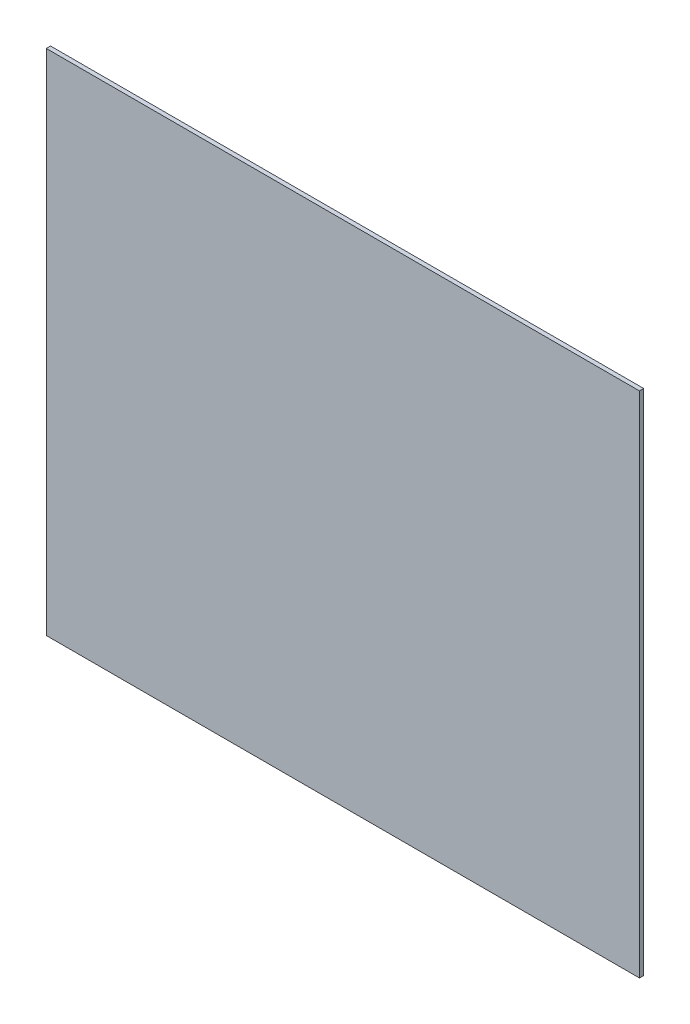
ISO-10303-21;
HEADER;
FILE_DESCRIPTION(('STEP AP214'),'2;1');
FILE_NAME('part.step','',(''),(''),'','','');
FILE_SCHEMA(('AUTOMOTIVE_DESIGN { 1 0 10303 214 1 1 1 1 }'));
ENDSEC;
DATA;
#1=APPLICATION_CONTEXT('core data for automotive mechanical design processes');
#2=APPLICATION_PROTOCOL_DEFINITION('international standard','automotive_design',2000,#1);
#3=PRODUCT_CONTEXT('',#1,'mechanical');
#4=PRODUCT('Part','Part','',(#3));
#5=PRODUCT_RELATED_PRODUCT_CATEGORY('part','',(#4));
#6=PRODUCT_DEFINITION_FORMATION('','',#4);
#7=PRODUCT_DEFINITION_CONTEXT('part definition',#1,'design');
#8=PRODUCT_DEFINITION('design','',#6,#7);
#9=PRODUCT_DEFINITION_SHAPE('','',#8);
#10=(LENGTH_UNIT() NAMED_UNIT(*) SI_UNIT(.MILLI.,.METRE.));
#11=(NAMED_UNIT(*) PLANE_ANGLE_UNIT() SI_UNIT($,.RADIAN.));
#12=(NAMED_UNIT(*) SI_UNIT($,.STERADIAN.) SOLID_ANGLE_UNIT());
#13=UNCERTAINTY_MEASURE_WITH_UNIT(LENGTH_MEASURE(1.E-05),#10,'distance_accuracy_value','');
#14=(GEOMETRIC_REPRESENTATION_CONTEXT(3) GLOBAL_UNCERTAINTY_ASSIGNED_CONTEXT((#13)) GLOBAL_UNIT_ASSIGNED_CONTEXT((#10,
#11,#12)) REPRESENTATION_CONTEXT('',''));
#15=CARTESIAN_POINT('',(0.,0.,0.));
#16=DIRECTION('',(0.,0.,1.));
#17=DIRECTION('',(1.,0.,0.));
#18=AXIS2_PLACEMENT_3D('',#15,#16,#17);
#19=CARTESIAN_POINT('',(-140.,-120.,2.));
#20=DIRECTION('',(1.,0.,0.));
#21=DIRECTION('',(0.,0.,-1.));
#22=AXIS2_PLACEMENT_3D('',#19,#20,#21);
#23=PLANE('',#22);
#24=DIRECTION('',(0.,-1.,0.));
#25=VECTOR('',#24,1.);
#26=CARTESIAN_POINT('',(-140.,-120.,0.));
#27=LINE('',#26,#25);
#28=CARTESIAN_POINT('',(-140.,120.,0.));
#29=VERTEX_POINT('',#28);
#30=CARTESIAN_POINT('',(-140.,-120.,0.));
#31=VERTEX_POINT('',#30);
#32=EDGE_CURVE('E98',#29,#31,#27,.T.);
#33=ORIENTED_EDGE('',*,*,#32,.T.);
#34=DIRECTION('',(0.,0.,-1.));
#35=VECTOR('',#34,1.);
#36=CARTESIAN_POINT('',(-140.,-120.,2.));
#37=LINE('',#36,#35);
#38=CARTESIAN_POINT('',(-140.,-120.,2.));
#39=VERTEX_POINT('',#38);
#40=EDGE_CURVE('E11',#39,#31,#37,.T.);
#41=ORIENTED_EDGE('',*,*,#40,.F.);
#42=DIRECTION('',(0.,-1.,0.));
#43=VECTOR('',#42,1.);
#44=CARTESIAN_POINT('',(-140.,-120.,2.));
#45=LINE('',#44,#43);
#46=CARTESIAN_POINT('',(-140.,120.,2.));
#47=VERTEX_POINT('',#46);
#48=EDGE_CURVE('E86',#47,#39,#45,.T.);
#49=ORIENTED_EDGE('',*,*,#48,.F.);
#50=DIRECTION('',(0.,0.,-1.));
#51=VECTOR('',#50,1.);
#52=CARTESIAN_POINT('',(-140.,120.,2.));
#53=LINE('',#52,#51);
#54=EDGE_CURVE('E94',#47,#29,#53,.T.);
#55=ORIENTED_EDGE('',*,*,#54,.T.);
#56=EDGE_LOOP('',(#33,#41,#49,#55));
#57=FACE_BOUND('',#56,.T.);
#58=ADVANCED_FACE('F35',(#57),#23,.F.);
#59=CARTESIAN_POINT('',(140.,-120.,2.));
#60=DIRECTION('',(0.,1.,0.));
#61=DIRECTION('',(-1.,0.,0.));
#62=AXIS2_PLACEMENT_3D('',#59,#60,#61);
#63=PLANE('',#62);
#64=DIRECTION('',(1.,0.,0.));
#65=VECTOR('',#64,1.);
#66=CARTESIAN_POINT('',(140.,-120.,0.));
#67=LINE('',#66,#65);
#68=CARTESIAN_POINT('',(140.,-120.,0.));
#69=VERTEX_POINT('',#68);
#70=EDGE_CURVE('E90',#31,#69,#67,.T.);
#71=ORIENTED_EDGE('',*,*,#70,.T.);
#72=DIRECTION('',(0.,0.,-1.));
#73=VECTOR('',#72,1.);
#74=CARTESIAN_POINT('',(140.,-120.,2.));
#75=LINE('',#74,#73);
#76=CARTESIAN_POINT('',(140.,-120.,2.));
#77=VERTEX_POINT('',#76);
#78=EDGE_CURVE('E43',#77,#69,#75,.T.);
#79=ORIENTED_EDGE('',*,*,#78,.F.);
#80=DIRECTION('',(1.,0.,0.));
#81=VECTOR('',#80,1.);
#82=CARTESIAN_POINT('',(140.,-120.,2.));
#83=LINE('',#82,#81);
#84=EDGE_CURVE('E81',#39,#77,#83,.T.);
#85=ORIENTED_EDGE('',*,*,#84,.F.);
#86=ORIENTED_EDGE('',*,*,#40,.T.);
#87=EDGE_LOOP('',(#71,#79,#85,#86));
#88=FACE_BOUND('',#87,.T.);
#89=ADVANCED_FACE('F89',(#88),#63,.F.);
#90=CARTESIAN_POINT('',(140.,-120.,2.));
#91=DIRECTION('',(-1.,0.,0.));
#92=DIRECTION('',(0.,0.,1.));
#93=AXIS2_PLACEMENT_3D('',#90,#91,#92);
#94=PLANE('',#93);
#95=DIRECTION('',(0.,1.,0.));
#96=VECTOR('',#95,1.);
#97=CARTESIAN_POINT('',(140.,-120.,0.));
#98=LINE('',#97,#96);
#99=CARTESIAN_POINT('',(140.,120.,0.));
#100=VERTEX_POINT('',#99);
#101=EDGE_CURVE('E68',#69,#100,#98,.T.);
#102=ORIENTED_EDGE('',*,*,#101,.T.);
#103=DIRECTION('',(0.,0.,-1.));
#104=VECTOR('',#103,1.);
#105=CARTESIAN_POINT('',(140.,120.,2.));
#106=LINE('',#105,#104);
#107=CARTESIAN_POINT('',(140.,120.,2.));
#108=VERTEX_POINT('',#107);
#109=EDGE_CURVE('E91',#108,#100,#106,.T.);
#110=ORIENTED_EDGE('',*,*,#109,.F.);
#111=DIRECTION('',(0.,1.,0.));
#112=VECTOR('',#111,1.);
#113=CARTESIAN_POINT('',(140.,-120.,2.));
#114=LINE('',#113,#112);
#115=EDGE_CURVE('E84',#77,#108,#114,.T.);
#116=ORIENTED_EDGE('',*,*,#115,.F.);
#117=ORIENTED_EDGE('',*,*,#78,.T.);
#118=EDGE_LOOP('',(#102,#110,#116,#117));
#119=FACE_BOUND('',#118,.T.);
#120=ADVANCED_FACE('F92',(#119),#94,.F.);
#121=CARTESIAN_POINT('',(140.,120.,2.));
#122=DIRECTION('',(0.,-1.,0.));
#123=DIRECTION('',(1.,0.,0.));
#124=AXIS2_PLACEMENT_3D('',#121,#122,#123);
#125=PLANE('',#124);
#126=DIRECTION('',(-1.,0.,0.));
#127=VECTOR('',#126,1.);
#128=CARTESIAN_POINT('',(140.,120.,0.));
#129=LINE('',#128,#127);
#130=EDGE_CURVE('E74',#100,#29,#129,.T.);
#131=ORIENTED_EDGE('',*,*,#130,.T.);
#132=ORIENTED_EDGE('',*,*,#54,.F.);
#133=DIRECTION('',(-1.,0.,0.));
#134=VECTOR('',#133,1.);
#135=CARTESIAN_POINT('',(140.,120.,2.));
#136=LINE('',#135,#134);
#137=EDGE_CURVE('E51',#108,#47,#136,.T.);
#138=ORIENTED_EDGE('',*,*,#137,.F.);
#139=ORIENTED_EDGE('',*,*,#109,.T.);
#140=EDGE_LOOP('',(#131,#132,#138,#139));
#141=FACE_BOUND('',#140,.T.);
#142=ADVANCED_FACE('F105',(#141),#125,.F.);
#143=CARTESIAN_POINT('',(0.,0.,2.));
#144=DIRECTION('',(0.,0.,1.));
#145=DIRECTION('',(1.,0.,0.));
#146=AXIS2_PLACEMENT_3D('',#143,#144,#145);
#147=PLANE('',#146);
#148=ORIENTED_EDGE('',*,*,#48,.T.);
#149=ORIENTED_EDGE('',*,*,#84,.T.);
#150=ORIENTED_EDGE('',*,*,#115,.T.);
#151=ORIENTED_EDGE('',*,*,#137,.T.);
#152=EDGE_LOOP('',(#148,#149,#150,#151));
#153=FACE_BOUND('',#152,.T.);
#154=ADVANCED_FACE('F82',(#153),#147,.T.);
#155=CARTESIAN_POINT('',(0.,0.,0.));
#156=DIRECTION('',(0.,0.,1.));
#157=DIRECTION('',(1.,0.,0.));
#158=AXIS2_PLACEMENT_3D('',#155,#156,#157);
#159=PLANE('',#158);
#160=ORIENTED_EDGE('',*,*,#32,.F.);
#161=ORIENTED_EDGE('',*,*,#130,.F.);
#162=ORIENTED_EDGE('',*,*,#101,.F.);
#163=ORIENTED_EDGE('',*,*,#70,.F.);
#164=EDGE_LOOP('',(#160,#161,#162,#163));
#165=FACE_BOUND('',#164,.T.);
#166=ADVANCED_FACE('F108',(#165),#159,.F.);
#167=CLOSED_SHELL('',(#58,#89,#120,#142,#154,#166));
#168=MANIFOLD_SOLID_BREP('B2',#167);
#169=ADVANCED_BREP_SHAPE_REPRESENTATION('',(#18,#168),#14);
#170=SHAPE_DEFINITION_REPRESENTATION(#9,#169);
ENDSEC;
END-ISO-10303-21;
